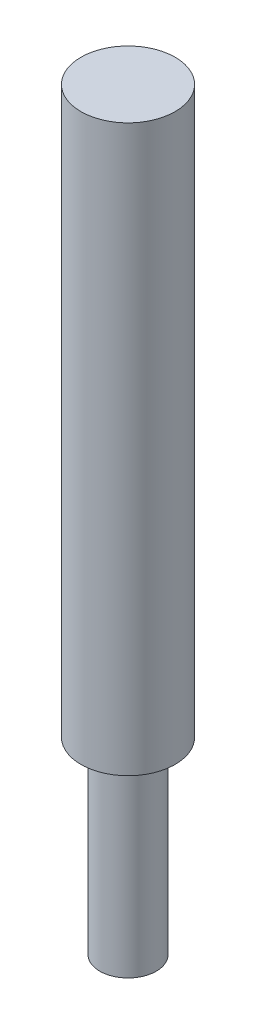
ISO-10303-21;
HEADER;
FILE_DESCRIPTION(('STEP AP214'),'2;1');
FILE_NAME('part.step','',(''),(''),'','','');
FILE_SCHEMA(('AUTOMOTIVE_DESIGN { 1 0 10303 214 1 1 1 1 }'));
ENDSEC;
DATA;
#1=APPLICATION_CONTEXT('core data for automotive mechanical design processes');
#2=APPLICATION_PROTOCOL_DEFINITION('international standard','automotive_design',2000,#1);
#3=PRODUCT_CONTEXT('',#1,'mechanical');
#4=PRODUCT('Part','Part','',(#3));
#5=PRODUCT_RELATED_PRODUCT_CATEGORY('part','',(#4));
#6=PRODUCT_DEFINITION_FORMATION('','',#4);
#7=PRODUCT_DEFINITION_CONTEXT('part definition',#1,'design');
#8=PRODUCT_DEFINITION('design','',#6,#7);
#9=PRODUCT_DEFINITION_SHAPE('','',#8);
#10=(LENGTH_UNIT() NAMED_UNIT(*) SI_UNIT(.MILLI.,.METRE.));
#11=(NAMED_UNIT(*) PLANE_ANGLE_UNIT() SI_UNIT($,.RADIAN.));
#12=(NAMED_UNIT(*) SI_UNIT($,.STERADIAN.) SOLID_ANGLE_UNIT());
#13=UNCERTAINTY_MEASURE_WITH_UNIT(LENGTH_MEASURE(1.E-05),#10,'distance_accuracy_value','');
#14=(GEOMETRIC_REPRESENTATION_CONTEXT(3) GLOBAL_UNCERTAINTY_ASSIGNED_CONTEXT((#13)) GLOBAL_UNIT_ASSIGNED_CONTEXT((#10,
#11,#12)) REPRESENTATION_CONTEXT('',''));
#15=CARTESIAN_POINT('',(0.,0.,0.));
#16=DIRECTION('',(0.,0.,1.));
#17=DIRECTION('',(1.,0.,0.));
#18=AXIS2_PLACEMENT_3D('',#15,#16,#17);
#19=CARTESIAN_POINT('',(0.,40.,0.));
#20=DIRECTION('',(0.,-1.,0.));
#21=DIRECTION('',(0.,0.,-1.));
#22=AXIS2_PLACEMENT_3D('',#19,#20,#21);
#23=CYLINDRICAL_SURFACE('',#22,2.5);
#24=CARTESIAN_POINT('',(0.,40.,0.));
#25=DIRECTION('',(0.,1.,0.));
#26=DIRECTION('',(0.,0.,1.));
#27=AXIS2_PLACEMENT_3D('',#24,#25,#26);
#28=CIRCLE('',#27,2.5);
#29=CARTESIAN_POINT('',(0.,40.,2.5));
#30=VERTEX_POINT('',#29);
#31=EDGE_CURVE('E10',#30,#30,#28,.T.);
#32=ORIENTED_EDGE('',*,*,#31,.F.);
#33=EDGE_LOOP('',(#32));
#34=FACE_BOUND('',#33,.T.);
#35=CARTESIAN_POINT('',(0.,10.,0.));
#36=DIRECTION('',(0.,-1.,0.));
#37=DIRECTION('',(0.,0.,-1.));
#38=AXIS2_PLACEMENT_3D('',#35,#36,#37);
#39=CIRCLE('',#38,2.5);
#40=CARTESIAN_POINT('',(0.,10.,-2.5));
#41=VERTEX_POINT('',#40);
#42=EDGE_CURVE('E41',#41,#41,#39,.T.);
#43=ORIENTED_EDGE('',*,*,#42,.F.);
#44=EDGE_LOOP('',(#43));
#45=FACE_BOUND('',#44,.T.);
#46=ADVANCED_FACE('F35',(#34,#45),#23,.T.);
#47=CARTESIAN_POINT('',(0.,40.,0.));
#48=DIRECTION('',(0.,1.,0.));
#49=DIRECTION('',(0.,0.,1.));
#50=AXIS2_PLACEMENT_3D('',#47,#48,#49);
#51=PLANE('',#50);
#52=ORIENTED_EDGE('',*,*,#31,.T.);
#53=EDGE_LOOP('',(#52));
#54=FACE_BOUND('',#53,.T.);
#55=ADVANCED_FACE('F66',(#54),#51,.T.);
#56=CARTESIAN_POINT('',(0.,10.,0.));
#57=DIRECTION('',(0.,-1.,0.));
#58=DIRECTION('',(0.,0.,-1.));
#59=AXIS2_PLACEMENT_3D('',#56,#57,#58);
#60=PLANE('',#59);
#61=CARTESIAN_POINT('',(0.,10.,0.));
#62=DIRECTION('',(0.,-1.,0.));
#63=DIRECTION('',(0.,0.,-1.));
#64=AXIS2_PLACEMENT_3D('',#61,#62,#63);
#65=CIRCLE('',#64,1.5);
#66=CARTESIAN_POINT('',(0.,10.,-1.5));
#67=VERTEX_POINT('',#66);
#68=EDGE_CURVE('E45',#67,#67,#65,.T.);
#69=ORIENTED_EDGE('',*,*,#68,.F.);
#70=EDGE_LOOP('',(#69));
#71=FACE_BOUND('',#70,.T.);
#72=ORIENTED_EDGE('',*,*,#42,.T.);
#73=EDGE_LOOP('',(#72));
#74=FACE_BOUND('',#73,.T.);
#75=ADVANCED_FACE('F59',(#71,#74),#60,.T.);
#76=CARTESIAN_POINT('',(0.,10.,0.));
#77=DIRECTION('',(0.,-1.,0.));
#78=DIRECTION('',(0.,0.,-1.));
#79=AXIS2_PLACEMENT_3D('',#76,#77,#78);
#80=CYLINDRICAL_SURFACE('',#79,1.5);
#81=ORIENTED_EDGE('',*,*,#68,.T.);
#82=EDGE_LOOP('',(#81));
#83=FACE_BOUND('',#82,.T.);
#84=CARTESIAN_POINT('',(0.,0.,0.));
#85=DIRECTION('',(0.,-1.,0.));
#86=DIRECTION('',(0.,0.,-1.));
#87=AXIS2_PLACEMENT_3D('',#84,#85,#86);
#88=CIRCLE('',#87,1.5);
#89=CARTESIAN_POINT('',(0.,0.,-1.5));
#90=VERTEX_POINT('',#89);
#91=EDGE_CURVE('E49',#90,#90,#88,.T.);
#92=ORIENTED_EDGE('',*,*,#91,.F.);
#93=EDGE_LOOP('',(#92));
#94=FACE_BOUND('',#93,.T.);
#95=ADVANCED_FACE('F57',(#83,#94),#80,.T.);
#96=CARTESIAN_POINT('',(0.,0.,0.));
#97=DIRECTION('',(0.,1.,0.));
#98=DIRECTION('',(0.,0.,1.));
#99=AXIS2_PLACEMENT_3D('',#96,#97,#98);
#100=PLANE('',#99);
#101=ORIENTED_EDGE('',*,*,#91,.T.);
#102=EDGE_LOOP('',(#101));
#103=FACE_BOUND('',#102,.T.);
#104=ADVANCED_FACE('F55',(#103),#100,.F.);
#105=CLOSED_SHELL('',(#46,#55,#75,#95,#104));
#106=MANIFOLD_SOLID_BREP('B2',#105);
#107=ADVANCED_BREP_SHAPE_REPRESENTATION('',(#18,#106),#14);
#108=SHAPE_DEFINITION_REPRESENTATION(#9,#107);
ENDSEC;
END-ISO-10303-21;
